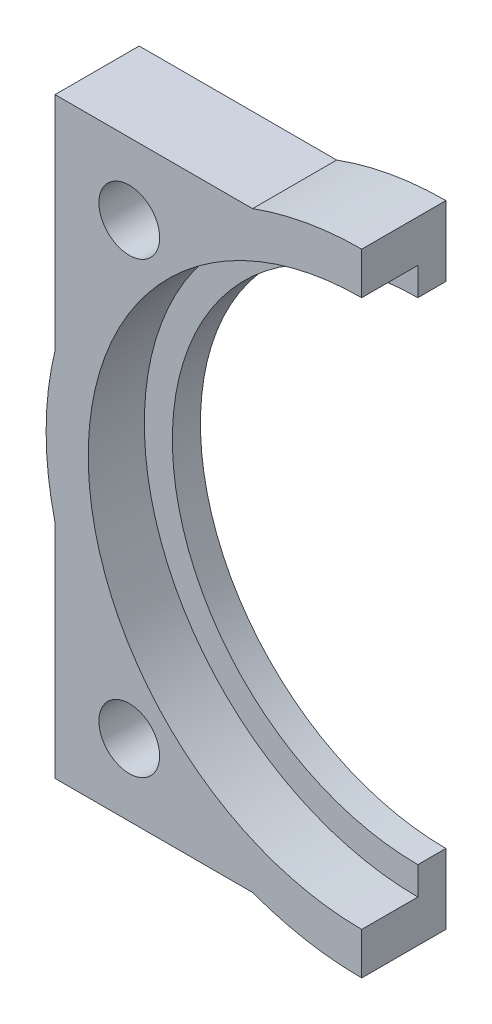
ISO-10303-21;
HEADER;
FILE_DESCRIPTION(('STEP AP214'),'2;1');
FILE_NAME('part.step','',(''),(''),'','','');
FILE_SCHEMA(('AUTOMOTIVE_DESIGN { 1 0 10303 214 1 1 1 1 }'));
ENDSEC;
DATA;
#1=APPLICATION_CONTEXT('core data for automotive mechanical design processes');
#2=APPLICATION_PROTOCOL_DEFINITION('international standard','automotive_design',2000,#1);
#3=PRODUCT_CONTEXT('',#1,'mechanical');
#4=PRODUCT('Part','Part','',(#3));
#5=PRODUCT_RELATED_PRODUCT_CATEGORY('part','',(#4));
#6=PRODUCT_DEFINITION_FORMATION('','',#4);
#7=PRODUCT_DEFINITION_CONTEXT('part definition',#1,'design');
#8=PRODUCT_DEFINITION('design','',#6,#7);
#9=PRODUCT_DEFINITION_SHAPE('','',#8);
#10=(LENGTH_UNIT() NAMED_UNIT(*) SI_UNIT(.MILLI.,.METRE.));
#11=(NAMED_UNIT(*) PLANE_ANGLE_UNIT() SI_UNIT($,.RADIAN.));
#12=(NAMED_UNIT(*) SI_UNIT($,.STERADIAN.) SOLID_ANGLE_UNIT());
#13=UNCERTAINTY_MEASURE_WITH_UNIT(LENGTH_MEASURE(1.E-05),#10,'distance_accuracy_value','');
#14=(GEOMETRIC_REPRESENTATION_CONTEXT(3) GLOBAL_UNCERTAINTY_ASSIGNED_CONTEXT((#13)) GLOBAL_UNIT_ASSIGNED_CONTEXT((#10,
#11,#12)) REPRESENTATION_CONTEXT('',''));
#15=CARTESIAN_POINT('',(0.,0.,0.));
#16=DIRECTION('',(0.,0.,1.));
#17=DIRECTION('',(1.,0.,0.));
#18=AXIS2_PLACEMENT_3D('',#15,#16,#17);
#19=CARTESIAN_POINT('',(0.,0.,0.));
#20=DIRECTION('',(0.,0.,1.));
#21=DIRECTION('',(1.,0.,0.));
#22=AXIS2_PLACEMENT_3D('',#19,#20,#21);
#23=PLANE('',#22);
#24=CARTESIAN_POINT('',(-16.5717156908569,-16.,0.));
#25=DIRECTION('',(0.,0.,-1.));
#26=DIRECTION('',(-1.,0.,0.));
#27=AXIS2_PLACEMENT_3D('',#24,#25,#26);
#28=CIRCLE('',#27,2.165);
#29=CARTESIAN_POINT('',(-18.7367156908569,-16.,0.));
#30=VERTEX_POINT('',#29);
#31=EDGE_CURVE('E304',#30,#30,#28,.T.);
#32=ORIENTED_EDGE('',*,*,#31,.F.);
#33=EDGE_LOOP('',(#32));
#34=FACE_BOUND('',#33,.T.);
#35=CARTESIAN_POINT('',(-16.5717156908569,16.,0.));
#36=DIRECTION('',(0.,0.,-1.));
#37=DIRECTION('',(-1.,0.,0.));
#38=AXIS2_PLACEMENT_3D('',#35,#36,#37);
#39=CIRCLE('',#38,2.165);
#40=CARTESIAN_POINT('',(-18.7367156908569,16.,0.));
#41=VERTEX_POINT('',#40);
#42=EDGE_CURVE('E300',#41,#41,#39,.T.);
#43=ORIENTED_EDGE('',*,*,#42,.F.);
#44=EDGE_LOOP('',(#43));
#45=FACE_BOUND('',#44,.T.);
#46=CARTESIAN_POINT('',(0.,0.,0.));
#47=DIRECTION('',(0.,0.,1.));
#48=DIRECTION('',(1.,0.,0.));
#49=AXIS2_PLACEMENT_3D('',#46,#47,#48);
#50=CIRCLE('',#49,22.4995417);
#51=CARTESIAN_POINT('',(0.,22.4995417,0.));
#52=VERTEX_POINT('',#51);
#53=CARTESIAN_POINT('',(-7.78357654700598,21.11031295,0.));
#54=VERTEX_POINT('',#53);
#55=EDGE_CURVE('E162',#52,#54,#50,.T.);
#56=ORIENTED_EDGE('',*,*,#55,.F.);
#57=DIRECTION('',(0.,-1.,0.));
#58=VECTOR('',#57,1.);
#59=CARTESIAN_POINT('',(0.,0.,0.));
#60=LINE('',#59,#58);
#61=CARTESIAN_POINT('',(0.,17.4995417,0.));
#62=VERTEX_POINT('',#61);
#63=EDGE_CURVE('E52',#52,#62,#60,.T.);
#64=ORIENTED_EDGE('',*,*,#63,.T.);
#65=CARTESIAN_POINT('',(0.,0.,0.));
#66=DIRECTION('',(0.,0.,1.));
#67=DIRECTION('',(1.,0.,0.));
#68=AXIS2_PLACEMENT_3D('',#65,#66,#67);
#69=CIRCLE('',#68,17.4995417);
#70=CARTESIAN_POINT('',(0.,-17.4995417,0.));
#71=VERTEX_POINT('',#70);
#72=EDGE_CURVE('E171',#62,#71,#69,.T.);
#73=ORIENTED_EDGE('',*,*,#72,.T.);
#74=CARTESIAN_POINT('',(0.,-22.4995417,0.));
#75=VERTEX_POINT('',#74);
#76=EDGE_CURVE('E168',#71,#75,#60,.T.);
#77=ORIENTED_EDGE('',*,*,#76,.T.);
#78=CARTESIAN_POINT('',(-7.78357654700598,-21.11031295,0.));
#79=VERTEX_POINT('',#78);
#80=EDGE_CURVE('E147',#79,#75,#50,.T.);
#81=ORIENTED_EDGE('',*,*,#80,.F.);
#82=DIRECTION('',(-1.,0.,0.));
#83=VECTOR('',#82,1.);
#84=CARTESIAN_POINT('',(-21.8646315220259,-21.11031295,0.));
#85=LINE('',#84,#83);
#86=CARTESIAN_POINT('',(-21.8646315220259,-21.11031295,0.));
#87=VERTEX_POINT('',#86);
#88=EDGE_CURVE('E154',#79,#87,#85,.T.);
#89=ORIENTED_EDGE('',*,*,#88,.T.);
#90=DIRECTION('',(0.,1.,0.));
#91=VECTOR('',#90,1.);
#92=CARTESIAN_POINT('',(-21.8646315220259,-21.11031295,0.));
#93=LINE('',#92,#91);
#94=CARTESIAN_POINT('',(-21.8646315220259,-5.30728415633346,0.));
#95=VERTEX_POINT('',#94);
#96=EDGE_CURVE('E152',#87,#95,#93,.T.);
#97=ORIENTED_EDGE('',*,*,#96,.T.);
#98=CARTESIAN_POINT('',(-21.864631522026,5.30728415633352,0.));
#99=VERTEX_POINT('',#98);
#100=EDGE_CURVE('E150',#99,#95,#50,.T.);
#101=ORIENTED_EDGE('',*,*,#100,.F.);
#102=DIRECTION('',(0.,1.,0.));
#103=VECTOR('',#102,1.);
#104=CARTESIAN_POINT('',(-21.864631522026,5.30728415633352,0.));
#105=LINE('',#104,#103);
#106=CARTESIAN_POINT('',(-21.8646315220259,21.11031295,0.));
#107=VERTEX_POINT('',#106);
#108=EDGE_CURVE('E131',#99,#107,#105,.T.);
#109=ORIENTED_EDGE('',*,*,#108,.T.);
#110=DIRECTION('',(1.,0.,0.));
#111=VECTOR('',#110,1.);
#112=CARTESIAN_POINT('',(-21.8646315220259,21.11031295,0.));
#113=LINE('',#112,#111);
#114=EDGE_CURVE('E141',#107,#54,#113,.T.);
#115=ORIENTED_EDGE('',*,*,#114,.T.);
#116=EDGE_LOOP('',(#56,#64,#73,#77,#81,#89,#97,#101,#109,#115));
#117=FACE_BOUND('',#116,.T.);
#118=ADVANCED_FACE('F34',(#34,#45,#117),#23,.F.);
#119=CARTESIAN_POINT('',(0.,0.,6.));
#120=DIRECTION('',(0.,0.,-1.));
#121=DIRECTION('',(-1.,0.,0.));
#122=AXIS2_PLACEMENT_3D('',#119,#120,#121);
#123=CYLINDRICAL_SURFACE('',#122,22.4995417);
#124=ORIENTED_EDGE('',*,*,#80,.T.);
#125=DIRECTION('',(0.,0.,-1.));
#126=VECTOR('',#125,1.);
#127=CARTESIAN_POINT('',(0.,-22.4995417,6.));
#128=LINE('',#127,#126);
#129=CARTESIAN_POINT('',(0.,-22.4995417,6.));
#130=VERTEX_POINT('',#129);
#131=EDGE_CURVE('E172',#75,#130,#128,.F.);
#132=ORIENTED_EDGE('',*,*,#131,.T.);
#133=CARTESIAN_POINT('',(0.,0.,6.));
#134=DIRECTION('',(0.,0.,1.));
#135=DIRECTION('',(1.,0.,0.));
#136=AXIS2_PLACEMENT_3D('',#133,#134,#135);
#137=CIRCLE('',#136,22.4995417);
#138=CARTESIAN_POINT('',(-7.78357654700597,-21.11031295,6.));
#139=VERTEX_POINT('',#138);
#140=EDGE_CURVE('E184',#139,#130,#137,.T.);
#141=ORIENTED_EDGE('',*,*,#140,.F.);
#142=DIRECTION('',(0.,0.,-1.));
#143=VECTOR('',#142,1.);
#144=CARTESIAN_POINT('',(-7.78357654700598,-21.11031295,6.));
#145=LINE('',#144,#143);
#146=EDGE_CURVE('E175',#139,#79,#145,.T.);
#147=ORIENTED_EDGE('',*,*,#146,.T.);
#148=EDGE_LOOP('',(#124,#132,#141,#147));
#149=FACE_BOUND('',#148,.T.);
#150=ADVANCED_FACE('F238',(#149),#123,.T.);
#151=CARTESIAN_POINT('',(-21.8646315220259,5.30728415633351,6.));
#152=VERTEX_POINT('',#151);
#153=CARTESIAN_POINT('',(-21.8646315220259,-5.30728415633346,6.));
#154=VERTEX_POINT('',#153);
#155=EDGE_CURVE('E188',#152,#154,#137,.T.);
#156=ORIENTED_EDGE('',*,*,#155,.F.);
#157=DIRECTION('',(0.,0.,-1.));
#158=VECTOR('',#157,1.);
#159=CARTESIAN_POINT('',(-21.864631522026,5.30728415633352,6.));
#160=LINE('',#159,#158);
#161=EDGE_CURVE('E204',#152,#99,#160,.T.);
#162=ORIENTED_EDGE('',*,*,#161,.T.);
#163=ORIENTED_EDGE('',*,*,#100,.T.);
#164=DIRECTION('',(0.,0.,-1.));
#165=VECTOR('',#164,1.);
#166=CARTESIAN_POINT('',(-21.864631522026,-5.30728415633352,6.));
#167=LINE('',#166,#165);
#168=EDGE_CURVE('E198',#154,#95,#167,.T.);
#169=ORIENTED_EDGE('',*,*,#168,.F.);
#170=EDGE_LOOP('',(#156,#162,#163,#169));
#171=FACE_BOUND('',#170,.T.);
#172=ADVANCED_FACE('F247',(#171),#123,.T.);
#173=CARTESIAN_POINT('',(0.,22.4995417,6.));
#174=VERTEX_POINT('',#173);
#175=CARTESIAN_POINT('',(-7.78357654700598,21.11031295,6.));
#176=VERTEX_POINT('',#175);
#177=EDGE_CURVE('E190',#174,#176,#137,.T.);
#178=ORIENTED_EDGE('',*,*,#177,.F.);
#179=DIRECTION('',(0.,0.,-1.));
#180=VECTOR('',#179,1.);
#181=CARTESIAN_POINT('',(0.,22.4995417,6.));
#182=LINE('',#181,#180);
#183=EDGE_CURVE('E161',#174,#52,#182,.T.);
#184=ORIENTED_EDGE('',*,*,#183,.T.);
#185=ORIENTED_EDGE('',*,*,#55,.T.);
#186=DIRECTION('',(0.,0.,-1.));
#187=VECTOR('',#186,1.);
#188=CARTESIAN_POINT('',(-7.783576547006,21.11031295,6.));
#189=LINE('',#188,#187);
#190=EDGE_CURVE('E144',#176,#54,#189,.T.);
#191=ORIENTED_EDGE('',*,*,#190,.F.);
#192=EDGE_LOOP('',(#178,#184,#185,#191));
#193=FACE_BOUND('',#192,.T.);
#194=ADVANCED_FACE('F219',(#193),#123,.T.);
#195=CARTESIAN_POINT('',(0.,0.,6.));
#196=DIRECTION('',(0.,0.,-1.));
#197=DIRECTION('',(-1.,0.,0.));
#198=AXIS2_PLACEMENT_3D('',#195,#196,#197);
#199=CYLINDRICAL_SURFACE('',#198,17.4995417);
#200=DIRECTION('',(0.,0.,-1.));
#201=VECTOR('',#200,1.);
#202=CARTESIAN_POINT('',(0.,17.4995417,6.));
#203=LINE('',#202,#201);
#204=CARTESIAN_POINT('',(0.,17.4995417,2.));
#205=VERTEX_POINT('',#204);
#206=EDGE_CURVE('E11',#205,#62,#203,.T.);
#207=ORIENTED_EDGE('',*,*,#206,.F.);
#208=CARTESIAN_POINT('',(0.,0.,2.));
#209=DIRECTION('',(0.,0.,1.));
#210=DIRECTION('',(1.,0.,0.));
#211=AXIS2_PLACEMENT_3D('',#208,#209,#210);
#212=CIRCLE('',#211,17.4995417);
#213=CARTESIAN_POINT('',(0.,-17.4995417,2.));
#214=VERTEX_POINT('',#213);
#215=EDGE_CURVE('E195',#205,#214,#212,.T.);
#216=ORIENTED_EDGE('',*,*,#215,.T.);
#217=DIRECTION('',(0.,0.,-1.));
#218=VECTOR('',#217,1.);
#219=CARTESIAN_POINT('',(0.,-17.4995417,6.));
#220=LINE('',#219,#218);
#221=EDGE_CURVE('E88',#71,#214,#220,.F.);
#222=ORIENTED_EDGE('',*,*,#221,.F.);
#223=ORIENTED_EDGE('',*,*,#72,.F.);
#224=EDGE_LOOP('',(#207,#216,#222,#223));
#225=FACE_BOUND('',#224,.T.);
#226=ADVANCED_FACE('F225',(#225),#199,.F.);
#227=CARTESIAN_POINT('',(0.,0.,6.));
#228=DIRECTION('',(0.,0.,1.));
#229=DIRECTION('',(1.,0.,0.));
#230=AXIS2_PLACEMENT_3D('',#227,#228,#229);
#231=PLANE('',#230);
#232=CARTESIAN_POINT('',(-16.5717156908569,-16.,6.));
#233=DIRECTION('',(0.,0.,-1.));
#234=DIRECTION('',(-1.,0.,0.));
#235=AXIS2_PLACEMENT_3D('',#232,#233,#234);
#236=CIRCLE('',#235,2.165);
#237=CARTESIAN_POINT('',(-18.7367156908569,-16.,6.));
#238=VERTEX_POINT('',#237);
#239=EDGE_CURVE('E301',#238,#238,#236,.T.);
#240=ORIENTED_EDGE('',*,*,#239,.T.);
#241=EDGE_LOOP('',(#240));
#242=FACE_BOUND('',#241,.T.);
#243=CARTESIAN_POINT('',(-16.5717156908569,16.,6.));
#244=DIRECTION('',(0.,0.,-1.));
#245=DIRECTION('',(-1.,0.,0.));
#246=AXIS2_PLACEMENT_3D('',#243,#244,#245);
#247=CIRCLE('',#246,2.165);
#248=CARTESIAN_POINT('',(-18.7367156908569,16.,6.));
#249=VERTEX_POINT('',#248);
#250=EDGE_CURVE('E222',#249,#249,#247,.T.);
#251=ORIENTED_EDGE('',*,*,#250,.T.);
#252=EDGE_LOOP('',(#251));
#253=FACE_BOUND('',#252,.T.);
#254=DIRECTION('',(0.,-1.,0.));
#255=VECTOR('',#254,1.);
#256=CARTESIAN_POINT('',(0.,0.,6.));
#257=LINE('',#256,#255);
#258=CARTESIAN_POINT('',(0.,19.4995417,6.));
#259=VERTEX_POINT('',#258);
#260=EDGE_CURVE('E178',#174,#259,#257,.T.);
#261=ORIENTED_EDGE('',*,*,#260,.F.);
#262=ORIENTED_EDGE('',*,*,#177,.T.);
#263=DIRECTION('',(1.,0.,0.));
#264=VECTOR('',#263,1.);
#265=CARTESIAN_POINT('',(-21.8646315220259,21.11031295,6.));
#266=LINE('',#265,#264);
#267=CARTESIAN_POINT('',(-21.8646315220259,21.11031295,6.));
#268=VERTEX_POINT('',#267);
#269=EDGE_CURVE('E137',#268,#176,#266,.T.);
#270=ORIENTED_EDGE('',*,*,#269,.F.);
#271=DIRECTION('',(0.,1.,0.));
#272=VECTOR('',#271,1.);
#273=CARTESIAN_POINT('',(-21.864631522026,5.30728415633352,6.));
#274=LINE('',#273,#272);
#275=EDGE_CURVE('E133',#152,#268,#274,.T.);
#276=ORIENTED_EDGE('',*,*,#275,.F.);
#277=ORIENTED_EDGE('',*,*,#155,.T.);
#278=DIRECTION('',(0.,1.,0.));
#279=VECTOR('',#278,1.);
#280=CARTESIAN_POINT('',(-21.8646315220259,-21.11031295,6.));
#281=LINE('',#280,#279);
#282=CARTESIAN_POINT('',(-21.8646315220259,-21.11031295,6.));
#283=VERTEX_POINT('',#282);
#284=EDGE_CURVE('E194',#283,#154,#281,.T.);
#285=ORIENTED_EDGE('',*,*,#284,.F.);
#286=DIRECTION('',(-1.,0.,0.));
#287=VECTOR('',#286,1.);
#288=CARTESIAN_POINT('',(-21.8646315220259,-21.11031295,6.));
#289=LINE('',#288,#287);
#290=EDGE_CURVE('E201',#139,#283,#289,.T.);
#291=ORIENTED_EDGE('',*,*,#290,.F.);
#292=ORIENTED_EDGE('',*,*,#140,.T.);
#293=CARTESIAN_POINT('',(0.,-19.4995417,6.));
#294=VERTEX_POINT('',#293);
#295=EDGE_CURVE('E177',#294,#130,#257,.T.);
#296=ORIENTED_EDGE('',*,*,#295,.F.);
#297=CARTESIAN_POINT('',(0.,0.,6.));
#298=DIRECTION('',(0.,0.,1.));
#299=DIRECTION('',(1.,0.,0.));
#300=AXIS2_PLACEMENT_3D('',#297,#298,#299);
#301=CIRCLE('',#300,19.4995417);
#302=EDGE_CURVE('E179',#259,#294,#301,.T.);
#303=ORIENTED_EDGE('',*,*,#302,.F.);
#304=EDGE_LOOP('',(#261,#262,#270,#276,#277,#285,#291,#292,#296,#303));
#305=FACE_BOUND('',#304,.T.);
#306=ADVANCED_FACE('F234',(#242,#253,#305),#231,.T.);
#307=CARTESIAN_POINT('',(0.,0.,2.));
#308=DIRECTION('',(0.,0.,1.));
#309=DIRECTION('',(1.,0.,0.));
#310=AXIS2_PLACEMENT_3D('',#307,#308,#309);
#311=CYLINDRICAL_SURFACE('',#310,19.4995417);
#312=ORIENTED_EDGE('',*,*,#302,.T.);
#313=DIRECTION('',(0.,0.,1.));
#314=VECTOR('',#313,1.);
#315=CARTESIAN_POINT('',(0.,-19.4995417,2.));
#316=LINE('',#315,#314);
#317=CARTESIAN_POINT('',(0.,-19.4995417,2.));
#318=VERTEX_POINT('',#317);
#319=EDGE_CURVE('E81',#294,#318,#316,.F.);
#320=ORIENTED_EDGE('',*,*,#319,.T.);
#321=CARTESIAN_POINT('',(0.,0.,2.));
#322=DIRECTION('',(0.,0.,1.));
#323=DIRECTION('',(1.,0.,0.));
#324=AXIS2_PLACEMENT_3D('',#321,#322,#323);
#325=CIRCLE('',#324,19.4995417);
#326=CARTESIAN_POINT('',(0.,19.4995417,2.));
#327=VERTEX_POINT('',#326);
#328=EDGE_CURVE('E167',#327,#318,#325,.T.);
#329=ORIENTED_EDGE('',*,*,#328,.F.);
#330=DIRECTION('',(0.,0.,1.));
#331=VECTOR('',#330,1.);
#332=CARTESIAN_POINT('',(0.,19.4995417,2.));
#333=LINE('',#332,#331);
#334=EDGE_CURVE('E164',#327,#259,#333,.T.);
#335=ORIENTED_EDGE('',*,*,#334,.T.);
#336=EDGE_LOOP('',(#312,#320,#329,#335));
#337=FACE_BOUND('',#336,.T.);
#338=ADVANCED_FACE('F233',(#337),#311,.F.);
#339=CARTESIAN_POINT('',(0.,0.,2.));
#340=DIRECTION('',(0.,0.,1.));
#341=DIRECTION('',(1.,0.,0.));
#342=AXIS2_PLACEMENT_3D('',#339,#340,#341);
#343=PLANE('',#342);
#344=DIRECTION('',(0.,-1.,0.));
#345=VECTOR('',#344,1.);
#346=CARTESIAN_POINT('',(0.,0.,2.));
#347=LINE('',#346,#345);
#348=EDGE_CURVE('E44',#327,#205,#347,.T.);
#349=ORIENTED_EDGE('',*,*,#348,.F.);
#350=ORIENTED_EDGE('',*,*,#328,.T.);
#351=EDGE_CURVE('E38',#214,#318,#347,.T.);
#352=ORIENTED_EDGE('',*,*,#351,.F.);
#353=ORIENTED_EDGE('',*,*,#215,.F.);
#354=EDGE_LOOP('',(#349,#350,#352,#353));
#355=FACE_BOUND('',#354,.T.);
#356=ADVANCED_FACE('F229',(#355),#343,.T.);
#357=CARTESIAN_POINT('',(-21.8646315220259,-21.11031295,6.));
#358=DIRECTION('',(-1.,0.,0.));
#359=DIRECTION('',(0.,-1.,0.));
#360=AXIS2_PLACEMENT_3D('',#357,#358,#359);
#361=PLANE('',#360);
#362=ORIENTED_EDGE('',*,*,#96,.F.);
#363=DIRECTION('',(0.,0.,-1.));
#364=VECTOR('',#363,1.);
#365=CARTESIAN_POINT('',(-21.8646315220259,-21.11031295,6.));
#366=LINE('',#365,#364);
#367=EDGE_CURVE('E160',#283,#87,#366,.T.);
#368=ORIENTED_EDGE('',*,*,#367,.F.);
#369=ORIENTED_EDGE('',*,*,#284,.T.);
#370=ORIENTED_EDGE('',*,*,#168,.T.);
#371=EDGE_LOOP('',(#362,#368,#369,#370));
#372=FACE_BOUND('',#371,.T.);
#373=ADVANCED_FACE('F246',(#372),#361,.T.);
#374=CARTESIAN_POINT('',(-21.8646315220259,-21.11031295,6.));
#375=DIRECTION('',(0.,-1.,0.));
#376=DIRECTION('',(0.,0.,-1.));
#377=AXIS2_PLACEMENT_3D('',#374,#375,#376);
#378=PLANE('',#377);
#379=ORIENTED_EDGE('',*,*,#88,.F.);
#380=ORIENTED_EDGE('',*,*,#146,.F.);
#381=ORIENTED_EDGE('',*,*,#290,.T.);
#382=ORIENTED_EDGE('',*,*,#367,.T.);
#383=EDGE_LOOP('',(#379,#380,#381,#382));
#384=FACE_BOUND('',#383,.T.);
#385=ADVANCED_FACE('F243',(#384),#378,.T.);
#386=CARTESIAN_POINT('',(-21.864631522026,5.30728415633352,6.));
#387=DIRECTION('',(-1.,0.,0.));
#388=DIRECTION('',(0.,-1.,0.));
#389=AXIS2_PLACEMENT_3D('',#386,#387,#388);
#390=PLANE('',#389);
#391=ORIENTED_EDGE('',*,*,#108,.F.);
#392=ORIENTED_EDGE('',*,*,#161,.F.);
#393=ORIENTED_EDGE('',*,*,#275,.T.);
#394=DIRECTION('',(0.,0.,-1.));
#395=VECTOR('',#394,1.);
#396=CARTESIAN_POINT('',(-21.8646315220259,21.11031295,6.));
#397=LINE('',#396,#395);
#398=EDGE_CURVE('E126',#268,#107,#397,.T.);
#399=ORIENTED_EDGE('',*,*,#398,.T.);
#400=EDGE_LOOP('',(#391,#392,#393,#399));
#401=FACE_BOUND('',#400,.T.);
#402=ADVANCED_FACE('F128',(#401),#390,.T.);
#403=CARTESIAN_POINT('',(-21.8646315220259,21.11031295,6.));
#404=DIRECTION('',(0.,1.,0.));
#405=DIRECTION('',(0.,0.,1.));
#406=AXIS2_PLACEMENT_3D('',#403,#404,#405);
#407=PLANE('',#406);
#408=ORIENTED_EDGE('',*,*,#114,.F.);
#409=ORIENTED_EDGE('',*,*,#398,.F.);
#410=ORIENTED_EDGE('',*,*,#269,.T.);
#411=ORIENTED_EDGE('',*,*,#190,.T.);
#412=EDGE_LOOP('',(#408,#409,#410,#411));
#413=FACE_BOUND('',#412,.T.);
#414=ADVANCED_FACE('F142',(#413),#407,.T.);
#415=CARTESIAN_POINT('',(0.,20.4250061284432,50.));
#416=DIRECTION('',(-1.,0.,0.));
#417=DIRECTION('',(0.,0.,1.));
#418=AXIS2_PLACEMENT_3D('',#415,#416,#417);
#419=PLANE('',#418);
#420=ORIENTED_EDGE('',*,*,#221,.T.);
#421=ORIENTED_EDGE('',*,*,#351,.T.);
#422=ORIENTED_EDGE('',*,*,#319,.F.);
#423=ORIENTED_EDGE('',*,*,#295,.T.);
#424=ORIENTED_EDGE('',*,*,#131,.F.);
#425=ORIENTED_EDGE('',*,*,#76,.F.);
#426=EDGE_LOOP('',(#420,#421,#422,#423,#424,#425));
#427=FACE_BOUND('',#426,.T.);
#428=ADVANCED_FACE('F236',(#427),#419,.F.);
#429=ORIENTED_EDGE('',*,*,#183,.F.);
#430=ORIENTED_EDGE('',*,*,#260,.T.);
#431=ORIENTED_EDGE('',*,*,#334,.F.);
#432=ORIENTED_EDGE('',*,*,#348,.T.);
#433=ORIENTED_EDGE('',*,*,#206,.T.);
#434=ORIENTED_EDGE('',*,*,#63,.F.);
#435=EDGE_LOOP('',(#429,#430,#431,#432,#433,#434));
#436=FACE_BOUND('',#435,.T.);
#437=ADVANCED_FACE('F36',(#436),#419,.F.);
#438=CARTESIAN_POINT('',(-16.5717156908569,16.,6.));
#439=DIRECTION('',(0.,0.,-1.));
#440=DIRECTION('',(-1.,0.,0.));
#441=AXIS2_PLACEMENT_3D('',#438,#439,#440);
#442=CYLINDRICAL_SURFACE('',#441,2.165);
#443=ORIENTED_EDGE('',*,*,#250,.F.);
#444=EDGE_LOOP('',(#443));
#445=FACE_BOUND('',#444,.T.);
#446=ORIENTED_EDGE('',*,*,#42,.T.);
#447=EDGE_LOOP('',(#446));
#448=FACE_BOUND('',#447,.T.);
#449=ADVANCED_FACE('F263',(#445,#448),#442,.F.);
#450=CARTESIAN_POINT('',(-16.5717156908569,-16.,6.));
#451=DIRECTION('',(0.,0.,-1.));
#452=DIRECTION('',(-1.,0.,0.));
#453=AXIS2_PLACEMENT_3D('',#450,#451,#452);
#454=CYLINDRICAL_SURFACE('',#453,2.165);
#455=ORIENTED_EDGE('',*,*,#239,.F.);
#456=EDGE_LOOP('',(#455));
#457=FACE_BOUND('',#456,.T.);
#458=ORIENTED_EDGE('',*,*,#31,.T.);
#459=EDGE_LOOP('',(#458));
#460=FACE_BOUND('',#459,.T.);
#461=ADVANCED_FACE('F289',(#457,#460),#454,.F.);
#462=CLOSED_SHELL('',(#118,#150,#172,#194,#226,#306,#338,#356,#373,#385,#402,#414,#428,#437,
#449,#461));
#463=MANIFOLD_SOLID_BREP('B2',#462);
#464=ADVANCED_BREP_SHAPE_REPRESENTATION('',(#18,#463),#14);
#465=SHAPE_DEFINITION_REPRESENTATION(#9,#464);
ENDSEC;
END-ISO-10303-21;
